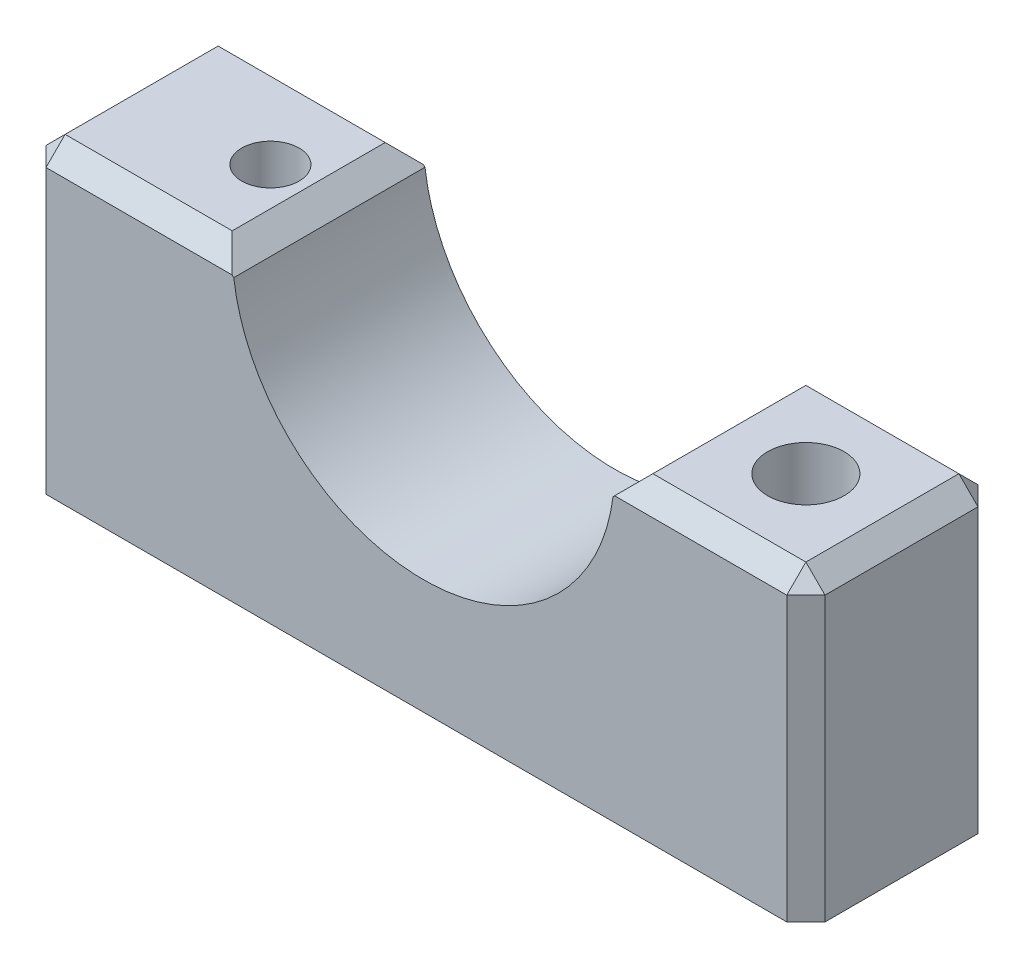
ISO-10303-21;
HEADER;
FILE_DESCRIPTION(('STEP AP214'),'2;1');
FILE_NAME('part.step','',(''),(''),'','','');
FILE_SCHEMA(('AUTOMOTIVE_DESIGN { 1 0 10303 214 1 1 1 1 }'));
ENDSEC;
DATA;
#1=APPLICATION_CONTEXT('core data for automotive mechanical design processes');
#2=APPLICATION_PROTOCOL_DEFINITION('international standard','automotive_design',2000,#1);
#3=PRODUCT_CONTEXT('',#1,'mechanical');
#4=PRODUCT('Part','Part','',(#3));
#5=PRODUCT_RELATED_PRODUCT_CATEGORY('part','',(#4));
#6=PRODUCT_DEFINITION_FORMATION('','',#4);
#7=PRODUCT_DEFINITION_CONTEXT('part definition',#1,'design');
#8=PRODUCT_DEFINITION('design','',#6,#7);
#9=PRODUCT_DEFINITION_SHAPE('','',#8);
#10=(LENGTH_UNIT() NAMED_UNIT(*) SI_UNIT(.MILLI.,.METRE.));
#11=(NAMED_UNIT(*) PLANE_ANGLE_UNIT() SI_UNIT($,.RADIAN.));
#12=(NAMED_UNIT(*) SI_UNIT($,.STERADIAN.) SOLID_ANGLE_UNIT());
#13=UNCERTAINTY_MEASURE_WITH_UNIT(LENGTH_MEASURE(1.E-05),#10,'distance_accuracy_value','');
#14=(GEOMETRIC_REPRESENTATION_CONTEXT(3) GLOBAL_UNCERTAINTY_ASSIGNED_CONTEXT((#13)) GLOBAL_UNIT_ASSIGNED_CONTEXT((#10,
#11,#12)) REPRESENTATION_CONTEXT('',''));
#15=CARTESIAN_POINT('',(0.,0.,0.));
#16=DIRECTION('',(0.,0.,1.));
#17=DIRECTION('',(1.,0.,0.));
#18=AXIS2_PLACEMENT_3D('',#15,#16,#17);
#19=CARTESIAN_POINT('',(0.,15.8,0.));
#20=DIRECTION('',(0.,1.,0.));
#21=DIRECTION('',(0.,0.,1.));
#22=AXIS2_PLACEMENT_3D('',#19,#20,#21);
#23=PLANE('',#22);
#24=DIRECTION('',(1.,0.,0.));
#25=VECTOR('',#24,1.);
#26=CARTESIAN_POINT('',(-9.99799979996,15.8,4.));
#27=LINE('',#26,#25);
#28=CARTESIAN_POINT('',(-19.7351198682707,15.8,4.));
#29=VERTEX_POINT('',#28);
#30=CARTESIAN_POINT('',(-10.99799979996,15.8,4.));
#31=VERTEX_POINT('',#30);
#32=EDGE_CURVE('E208',#29,#31,#27,.T.);
#33=ORIENTED_EDGE('',*,*,#32,.T.);
#34=DIRECTION('',(0.,0.,-1.));
#35=VECTOR('',#34,1.);
#36=CARTESIAN_POINT('',(-10.99799979996,15.8,-5.));
#37=LINE('',#36,#35);
#38=CARTESIAN_POINT('',(-10.99799979996,15.8,-4.));
#39=VERTEX_POINT('',#38);
#40=EDGE_CURVE('E212',#31,#39,#37,.T.);
#41=ORIENTED_EDGE('',*,*,#40,.T.);
#42=DIRECTION('',(-1.,0.,0.));
#43=VECTOR('',#42,1.);
#44=CARTESIAN_POINT('',(-20.7351198682707,15.8,-4.));
#45=LINE('',#44,#43);
#46=CARTESIAN_POINT('',(-19.7351198682707,15.8,-4.));
#47=VERTEX_POINT('',#46);
#48=EDGE_CURVE('E210',#39,#47,#45,.T.);
#49=ORIENTED_EDGE('',*,*,#48,.T.);
#50=DIRECTION('',(0.,0.,1.));
#51=VECTOR('',#50,1.);
#52=CARTESIAN_POINT('',(-19.7351198682707,15.8,5.));
#53=LINE('',#52,#51);
#54=EDGE_CURVE('E159',#47,#29,#53,.T.);
#55=ORIENTED_EDGE('',*,*,#54,.T.);
#56=EDGE_LOOP('',(#33,#41,#49,#55));
#57=FACE_BOUND('',#56,.T.);
#58=CARTESIAN_POINT('',(-13.,15.8,0.));
#59=DIRECTION('',(0.,1.,0.));
#60=DIRECTION('',(0.,0.,1.));
#61=AXIS2_PLACEMENT_3D('',#58,#59,#60);
#62=CIRCLE('',#61,1.5);
#63=CARTESIAN_POINT('',(-13.,15.8,1.5));
#64=VERTEX_POINT('',#63);
#65=EDGE_CURVE('E312',#64,#64,#62,.T.);
#66=ORIENTED_EDGE('',*,*,#65,.F.);
#67=EDGE_LOOP('',(#66));
#68=FACE_BOUND('',#67,.T.);
#69=ADVANCED_FACE('F37',(#57,#68),#23,.T.);
#70=DIRECTION('',(-1.,0.,0.));
#71=VECTOR('',#70,1.);
#72=CARTESIAN_POINT('',(9.99799979996,15.8,-3.99999999999999));
#73=LINE('',#72,#71);
#74=CARTESIAN_POINT('',(19.,15.8,-3.99999999999999));
#75=VERTEX_POINT('',#74);
#76=CARTESIAN_POINT('',(10.99799979996,15.8,-3.99999999999999));
#77=VERTEX_POINT('',#76);
#78=EDGE_CURVE('E191',#75,#77,#73,.T.);
#79=ORIENTED_EDGE('',*,*,#78,.T.);
#80=DIRECTION('',(0.,0.,1.));
#81=VECTOR('',#80,1.);
#82=CARTESIAN_POINT('',(10.99799979996,15.8,5.));
#83=LINE('',#82,#81);
#84=CARTESIAN_POINT('',(10.99799979996,15.8,3.99999999999999));
#85=VERTEX_POINT('',#84);
#86=EDGE_CURVE('E195',#77,#85,#83,.T.);
#87=ORIENTED_EDGE('',*,*,#86,.T.);
#88=DIRECTION('',(1.,0.,0.));
#89=VECTOR('',#88,1.);
#90=CARTESIAN_POINT('',(20.,15.8,3.99999999999999));
#91=LINE('',#90,#89);
#92=CARTESIAN_POINT('',(19.,15.8,3.99999999999999));
#93=VERTEX_POINT('',#92);
#94=EDGE_CURVE('E193',#85,#93,#91,.T.);
#95=ORIENTED_EDGE('',*,*,#94,.T.);
#96=DIRECTION('',(0.,0.,-1.));
#97=VECTOR('',#96,1.);
#98=CARTESIAN_POINT('',(19.,15.8,-5.));
#99=LINE('',#98,#97);
#100=EDGE_CURVE('E189',#93,#75,#99,.T.);
#101=ORIENTED_EDGE('',*,*,#100,.T.);
#102=EDGE_LOOP('',(#79,#87,#95,#101));
#103=FACE_BOUND('',#102,.T.);
#104=CARTESIAN_POINT('',(15.,15.8,0.));
#105=DIRECTION('',(0.,1.,0.));
#106=DIRECTION('',(0.,0.,1.));
#107=AXIS2_PLACEMENT_3D('',#104,#105,#106);
#108=CIRCLE('',#107,2.);
#109=CARTESIAN_POINT('',(15.,15.8,2.));
#110=VERTEX_POINT('',#109);
#111=EDGE_CURVE('E306',#110,#110,#108,.T.);
#112=ORIENTED_EDGE('',*,*,#111,.F.);
#113=EDGE_LOOP('',(#112));
#114=FACE_BOUND('',#113,.T.);
#115=ADVANCED_FACE('F367',(#103,#114),#23,.T.);
#116=CARTESIAN_POINT('',(0.,0.,0.));
#117=DIRECTION('',(0.,1.,0.));
#118=DIRECTION('',(0.,0.,1.));
#119=AXIS2_PLACEMENT_3D('',#116,#117,#118);
#120=PLANE('',#119);
#121=DIRECTION('',(-1.,0.,0.));
#122=VECTOR('',#121,1.);
#123=CARTESIAN_POINT('',(-18.,0.,-5.));
#124=LINE('',#123,#122);
#125=CARTESIAN_POINT('',(19.,0.,-5.));
#126=VERTEX_POINT('',#125);
#127=CARTESIAN_POINT('',(-19.7351198682707,0.,-5.));
#128=VERTEX_POINT('',#127);
#129=EDGE_CURVE('E291',#126,#128,#124,.T.);
#130=ORIENTED_EDGE('',*,*,#129,.F.);
#131=DIRECTION('',(-0.707106781186549,0.,-0.707106781186546));
#132=VECTOR('',#131,1.);
#133=CARTESIAN_POINT('',(19.,0.,-5.));
#134=LINE('',#133,#132);
#135=CARTESIAN_POINT('',(20.,0.,-3.99999999999999));
#136=VERTEX_POINT('',#135);
#137=EDGE_CURVE('E221',#126,#136,#134,.F.);
#138=ORIENTED_EDGE('',*,*,#137,.T.);
#139=DIRECTION('',(0.,0.,-1.));
#140=VECTOR('',#139,1.);
#141=CARTESIAN_POINT('',(20.,0.,-5.));
#142=LINE('',#141,#140);
#143=CARTESIAN_POINT('',(20.,0.,3.99999999999999));
#144=VERTEX_POINT('',#143);
#145=EDGE_CURVE('E315',#144,#136,#142,.T.);
#146=ORIENTED_EDGE('',*,*,#145,.F.);
#147=DIRECTION('',(0.707106781186549,0.,-0.707106781186546));
#148=VECTOR('',#147,1.);
#149=CARTESIAN_POINT('',(20.,0.,3.99999999999999));
#150=LINE('',#149,#148);
#151=CARTESIAN_POINT('',(19.,0.,5.));
#152=VERTEX_POINT('',#151);
#153=EDGE_CURVE('E219',#144,#152,#150,.F.);
#154=ORIENTED_EDGE('',*,*,#153,.T.);
#155=DIRECTION('',(1.,0.,0.));
#156=VECTOR('',#155,1.);
#157=CARTESIAN_POINT('',(-18.,0.,5.));
#158=LINE('',#157,#156);
#159=CARTESIAN_POINT('',(-19.7351198682707,0.,5.));
#160=VERTEX_POINT('',#159);
#161=EDGE_CURVE('E170',#160,#152,#158,.T.);
#162=ORIENTED_EDGE('',*,*,#161,.F.);
#163=DIRECTION('',(0.707106781186547,0.,0.707106781186548));
#164=VECTOR('',#163,1.);
#165=CARTESIAN_POINT('',(-19.7351198682707,0.,5.));
#166=LINE('',#165,#164);
#167=CARTESIAN_POINT('',(-20.7351198682707,0.,4.));
#168=VERTEX_POINT('',#167);
#169=EDGE_CURVE('E215',#160,#168,#166,.F.);
#170=ORIENTED_EDGE('',*,*,#169,.T.);
#171=DIRECTION('',(0.,0.,-1.));
#172=VECTOR('',#171,1.);
#173=CARTESIAN_POINT('',(-20.7351198682707,0.,-5.));
#174=LINE('',#173,#172);
#175=CARTESIAN_POINT('',(-20.7351198682707,0.,-4.));
#176=VERTEX_POINT('',#175);
#177=EDGE_CURVE('E253',#168,#176,#174,.T.);
#178=ORIENTED_EDGE('',*,*,#177,.T.);
#179=DIRECTION('',(-0.707106781186548,0.,0.707106781186547));
#180=VECTOR('',#179,1.);
#181=CARTESIAN_POINT('',(-19.7351198682707,0.,-5.));
#182=LINE('',#181,#180);
#183=EDGE_CURVE('E217',#176,#128,#182,.F.);
#184=ORIENTED_EDGE('',*,*,#183,.T.);
#185=EDGE_LOOP('',(#130,#138,#146,#154,#162,#170,#178,#184));
#186=FACE_BOUND('',#185,.T.);
#187=CARTESIAN_POINT('',(-13.,0.,0.));
#188=DIRECTION('',(0.,1.,0.));
#189=DIRECTION('',(0.,0.,1.));
#190=AXIS2_PLACEMENT_3D('',#187,#188,#189);
#191=CIRCLE('',#190,1.5);
#192=CARTESIAN_POINT('',(-13.,0.,1.5));
#193=VERTEX_POINT('',#192);
#194=EDGE_CURVE('E309',#193,#193,#191,.T.);
#195=ORIENTED_EDGE('',*,*,#194,.T.);
#196=EDGE_LOOP('',(#195));
#197=FACE_BOUND('',#196,.T.);
#198=CARTESIAN_POINT('',(15.,0.,0.));
#199=DIRECTION('',(0.,1.,0.));
#200=DIRECTION('',(0.,0.,1.));
#201=AXIS2_PLACEMENT_3D('',#198,#199,#200);
#202=CIRCLE('',#201,2.);
#203=CARTESIAN_POINT('',(15.,0.,2.));
#204=VERTEX_POINT('',#203);
#205=EDGE_CURVE('E303',#204,#204,#202,.T.);
#206=ORIENTED_EDGE('',*,*,#205,.T.);
#207=EDGE_LOOP('',(#206));
#208=FACE_BOUND('',#207,.T.);
#209=ADVANCED_FACE('F297',(#186,#197,#208),#120,.F.);
#210=CARTESIAN_POINT('',(20.,15.8,-5.));
#211=DIRECTION('',(-1.,0.,0.));
#212=DIRECTION('',(0.,0.,1.));
#213=AXIS2_PLACEMENT_3D('',#210,#211,#212);
#214=PLANE('',#213);
#215=ORIENTED_EDGE('',*,*,#145,.T.);
#216=DIRECTION('',(0.,1.,0.));
#217=VECTOR('',#216,1.);
#218=CARTESIAN_POINT('',(20.,15.8,-3.99999999999999));
#219=LINE('',#218,#217);
#220=CARTESIAN_POINT('',(20.,14.8,-3.99999999999999));
#221=VERTEX_POINT('',#220);
#222=EDGE_CURVE('E227',#136,#221,#219,.T.);
#223=ORIENTED_EDGE('',*,*,#222,.T.);
#224=DIRECTION('',(0.,0.,1.));
#225=VECTOR('',#224,1.);
#226=CARTESIAN_POINT('',(20.,14.8,5.));
#227=LINE('',#226,#225);
#228=CARTESIAN_POINT('',(20.,14.8,3.99999999999999));
#229=VERTEX_POINT('',#228);
#230=EDGE_CURVE('E223',#221,#229,#227,.T.);
#231=ORIENTED_EDGE('',*,*,#230,.T.);
#232=DIRECTION('',(0.,-1.,0.));
#233=VECTOR('',#232,1.);
#234=CARTESIAN_POINT('',(20.,15.8,3.99999999999999));
#235=LINE('',#234,#233);
#236=EDGE_CURVE('E225',#229,#144,#235,.T.);
#237=ORIENTED_EDGE('',*,*,#236,.T.);
#238=EDGE_LOOP('',(#215,#223,#231,#237));
#239=FACE_BOUND('',#238,.T.);
#240=ADVANCED_FACE('F358',(#239),#214,.F.);
#241=CARTESIAN_POINT('',(-18.,15.8,-5.));
#242=DIRECTION('',(0.,0.,1.));
#243=DIRECTION('',(1.,0.,0.));
#244=AXIS2_PLACEMENT_3D('',#241,#242,#243);
#245=PLANE('',#244);
#246=CARTESIAN_POINT('',(0.,16.,-5.));
#247=DIRECTION('',(0.,0.,1.));
#248=DIRECTION('',(1.,0.,0.));
#249=AXIS2_PLACEMENT_3D('',#246,#247,#248);
#250=CIRCLE('',#249,10.);
#251=CARTESIAN_POINT('',(-9.91770342303226,14.7197036230723,-5.));
#252=VERTEX_POINT('',#251);
#253=CARTESIAN_POINT('',(9.91770342303226,14.7197036230723,-5.));
#254=VERTEX_POINT('',#253);
#255=EDGE_CURVE('E301',#252,#254,#250,.T.);
#256=ORIENTED_EDGE('',*,*,#255,.T.);
#257=DIRECTION('',(0.707106781186546,0.707106781186549,0.));
#258=VECTOR('',#257,1.);
#259=CARTESIAN_POINT('',(9.91770342303226,14.7197036230723,-5.));
#260=LINE('',#259,#258);
#261=CARTESIAN_POINT('',(9.99799979996,14.8,-5.));
#262=VERTEX_POINT('',#261);
#263=EDGE_CURVE('E174',#254,#262,#260,.T.);
#264=ORIENTED_EDGE('',*,*,#263,.T.);
#265=DIRECTION('',(1.,0.,0.));
#266=VECTOR('',#265,1.);
#267=CARTESIAN_POINT('',(20.,14.8,-5.));
#268=LINE('',#267,#266);
#269=CARTESIAN_POINT('',(19.,14.8,-5.));
#270=VERTEX_POINT('',#269);
#271=EDGE_CURVE('E186',#262,#270,#268,.T.);
#272=ORIENTED_EDGE('',*,*,#271,.T.);
#273=DIRECTION('',(0.,-1.,0.));
#274=VECTOR('',#273,1.);
#275=CARTESIAN_POINT('',(19.,15.8,-5.));
#276=LINE('',#275,#274);
#277=EDGE_CURVE('E184',#270,#126,#276,.T.);
#278=ORIENTED_EDGE('',*,*,#277,.T.);
#279=ORIENTED_EDGE('',*,*,#129,.T.);
#280=DIRECTION('',(0.,1.,0.));
#281=VECTOR('',#280,1.);
#282=CARTESIAN_POINT('',(-19.7351198682707,15.8,-5.));
#283=LINE('',#282,#281);
#284=CARTESIAN_POINT('',(-19.7351198682707,14.8,-5.));
#285=VERTEX_POINT('',#284);
#286=EDGE_CURVE('E175',#128,#285,#283,.T.);
#287=ORIENTED_EDGE('',*,*,#286,.T.);
#288=DIRECTION('',(1.,0.,0.));
#289=VECTOR('',#288,1.);
#290=CARTESIAN_POINT('',(-9.99799979996,14.8,-5.));
#291=LINE('',#290,#289);
#292=CARTESIAN_POINT('',(-9.99799979996001,14.8,-5.));
#293=VERTEX_POINT('',#292);
#294=EDGE_CURVE('E177',#285,#293,#291,.T.);
#295=ORIENTED_EDGE('',*,*,#294,.T.);
#296=DIRECTION('',(-0.707106781186546,0.707106781186549,0.));
#297=VECTOR('',#296,1.);
#298=CARTESIAN_POINT('',(-9.91770342303226,14.7197036230723,-5.));
#299=LINE('',#298,#297);
#300=EDGE_CURVE('E182',#293,#252,#299,.F.);
#301=ORIENTED_EDGE('',*,*,#300,.T.);
#302=EDGE_LOOP('',(#256,#264,#272,#278,#279,#287,#295,#301));
#303=FACE_BOUND('',#302,.T.);
#304=ADVANCED_FACE('F287',(#303),#245,.F.);
#305=CARTESIAN_POINT('',(-18.,15.8,5.));
#306=DIRECTION('',(0.,0.,-1.));
#307=DIRECTION('',(-1.,0.,0.));
#308=AXIS2_PLACEMENT_3D('',#305,#306,#307);
#309=PLANE('',#308);
#310=DIRECTION('',(-1.,0.,0.));
#311=VECTOR('',#310,1.);
#312=CARTESIAN_POINT('',(9.99799979996,14.8,5.));
#313=LINE('',#312,#311);
#314=CARTESIAN_POINT('',(19.,14.8,5.));
#315=VERTEX_POINT('',#314);
#316=CARTESIAN_POINT('',(9.99799979996,14.8,5.));
#317=VERTEX_POINT('',#316);
#318=EDGE_CURVE('E155',#315,#317,#313,.T.);
#319=ORIENTED_EDGE('',*,*,#318,.T.);
#320=DIRECTION('',(-0.707106781186546,-0.707106781186549,0.));
#321=VECTOR('',#320,1.);
#322=CARTESIAN_POINT('',(9.91770342303226,14.7197036230723,5.));
#323=LINE('',#322,#321);
#324=CARTESIAN_POINT('',(9.91770342303226,14.7197036230723,5.));
#325=VERTEX_POINT('',#324);
#326=EDGE_CURVE('E150',#317,#325,#323,.T.);
#327=ORIENTED_EDGE('',*,*,#326,.T.);
#328=CARTESIAN_POINT('',(0.,16.,5.));
#329=DIRECTION('',(0.,0.,-1.));
#330=DIRECTION('',(-1.,0.,0.));
#331=AXIS2_PLACEMENT_3D('',#328,#329,#330);
#332=CIRCLE('',#331,10.);
#333=CARTESIAN_POINT('',(-9.91770342303226,14.7197036230723,5.));
#334=VERTEX_POINT('',#333);
#335=EDGE_CURVE('E153',#325,#334,#332,.T.);
#336=ORIENTED_EDGE('',*,*,#335,.T.);
#337=DIRECTION('',(0.707106781186546,-0.707106781186549,0.));
#338=VECTOR('',#337,1.);
#339=CARTESIAN_POINT('',(-9.91770342303226,14.7197036230723,5.));
#340=LINE('',#339,#338);
#341=CARTESIAN_POINT('',(-9.99799979996001,14.8,5.));
#342=VERTEX_POINT('',#341);
#343=EDGE_CURVE('E202',#334,#342,#340,.F.);
#344=ORIENTED_EDGE('',*,*,#343,.T.);
#345=DIRECTION('',(-1.,0.,0.));
#346=VECTOR('',#345,1.);
#347=CARTESIAN_POINT('',(-20.7351198682707,14.8,5.));
#348=LINE('',#347,#346);
#349=CARTESIAN_POINT('',(-19.7351198682707,14.8,5.));
#350=VERTEX_POINT('',#349);
#351=EDGE_CURVE('E200',#342,#350,#348,.T.);
#352=ORIENTED_EDGE('',*,*,#351,.T.);
#353=DIRECTION('',(0.,-1.,0.));
#354=VECTOR('',#353,1.);
#355=CARTESIAN_POINT('',(-19.7351198682707,15.8,5.));
#356=LINE('',#355,#354);
#357=EDGE_CURVE('E198',#350,#160,#356,.T.);
#358=ORIENTED_EDGE('',*,*,#357,.T.);
#359=ORIENTED_EDGE('',*,*,#161,.T.);
#360=DIRECTION('',(0.,1.,0.));
#361=VECTOR('',#360,1.);
#362=CARTESIAN_POINT('',(19.,15.8,5.));
#363=LINE('',#362,#361);
#364=EDGE_CURVE('E204',#152,#315,#363,.T.);
#365=ORIENTED_EDGE('',*,*,#364,.T.);
#366=EDGE_LOOP('',(#319,#327,#336,#344,#352,#358,#359,#365));
#367=FACE_BOUND('',#366,.T.);
#368=ADVANCED_FACE('F152',(#367),#309,.F.);
#369=CARTESIAN_POINT('',(-13.,15.8,0.));
#370=DIRECTION('',(0.,-1.,0.));
#371=DIRECTION('',(0.,0.,-1.));
#372=AXIS2_PLACEMENT_3D('',#369,#370,#371);
#373=CYLINDRICAL_SURFACE('',#372,1.5);
#374=ORIENTED_EDGE('',*,*,#65,.T.);
#375=EDGE_LOOP('',(#374));
#376=FACE_BOUND('',#375,.T.);
#377=ORIENTED_EDGE('',*,*,#194,.F.);
#378=EDGE_LOOP('',(#377));
#379=FACE_BOUND('',#378,.T.);
#380=ADVANCED_FACE('F378',(#376,#379),#373,.F.);
#381=CARTESIAN_POINT('',(15.,15.8,0.));
#382=DIRECTION('',(0.,-1.,0.));
#383=DIRECTION('',(0.,0.,-1.));
#384=AXIS2_PLACEMENT_3D('',#381,#382,#383);
#385=CYLINDRICAL_SURFACE('',#384,2.);
#386=ORIENTED_EDGE('',*,*,#111,.T.);
#387=EDGE_LOOP('',(#386));
#388=FACE_BOUND('',#387,.T.);
#389=ORIENTED_EDGE('',*,*,#205,.F.);
#390=EDGE_LOOP('',(#389));
#391=FACE_BOUND('',#390,.T.);
#392=ADVANCED_FACE('F385',(#388,#391),#385,.F.);
#393=CARTESIAN_POINT('',(0.,16.,-5.));
#394=DIRECTION('',(0.,0.,1.));
#395=DIRECTION('',(1.,0.,0.));
#396=AXIS2_PLACEMENT_3D('',#393,#394,#395);
#397=CYLINDRICAL_SURFACE('',#396,10.);
#398=ORIENTED_EDGE('',*,*,#335,.F.);
#399=DIRECTION('',(0.,0.,1.));
#400=VECTOR('',#399,1.);
#401=CARTESIAN_POINT('',(9.91770342303226,14.7197036230723,-5.));
#402=LINE('',#401,#400);
#403=EDGE_CURVE('E166',#325,#254,#402,.F.);
#404=ORIENTED_EDGE('',*,*,#403,.T.);
#405=ORIENTED_EDGE('',*,*,#255,.F.);
#406=DIRECTION('',(0.,0.,1.));
#407=VECTOR('',#406,1.);
#408=CARTESIAN_POINT('',(-9.91770342303226,14.7197036230723,-5.));
#409=LINE('',#408,#407);
#410=EDGE_CURVE('E169',#252,#334,#409,.T.);
#411=ORIENTED_EDGE('',*,*,#410,.T.);
#412=EDGE_LOOP('',(#398,#404,#405,#411));
#413=FACE_BOUND('',#412,.T.);
#414=ADVANCED_FACE('F164',(#413),#397,.F.);
#415=CARTESIAN_POINT('',(-20.7351198682707,1.98278893304149E-12,-17.735954124484));
#416=DIRECTION('',(1.,0.,0.));
#417=DIRECTION('',(0.,0.,-1.));
#418=AXIS2_PLACEMENT_3D('',#415,#416,#417);
#419=PLANE('',#418);
#420=DIRECTION('',(0.,0.,-1.));
#421=VECTOR('',#420,1.);
#422=CARTESIAN_POINT('',(-20.7351198682707,14.8,-5.));
#423=LINE('',#422,#421);
#424=CARTESIAN_POINT('',(-20.7351198682707,14.8,4.));
#425=VERTEX_POINT('',#424);
#426=CARTESIAN_POINT('',(-20.7351198682707,14.8,-4.));
#427=VERTEX_POINT('',#426);
#428=EDGE_CURVE('E54',#425,#427,#423,.T.);
#429=ORIENTED_EDGE('',*,*,#428,.T.);
#430=DIRECTION('',(0.,-1.,0.));
#431=VECTOR('',#430,1.);
#432=CARTESIAN_POINT('',(-20.7351198682707,1.98278893304149E-12,-4.));
#433=LINE('',#432,#431);
#434=EDGE_CURVE('E11',#427,#176,#433,.T.);
#435=ORIENTED_EDGE('',*,*,#434,.T.);
#436=ORIENTED_EDGE('',*,*,#177,.F.);
#437=DIRECTION('',(0.,1.,0.));
#438=VECTOR('',#437,1.);
#439=CARTESIAN_POINT('',(-20.7351198682707,1.98278893304149E-12,4.));
#440=LINE('',#439,#438);
#441=EDGE_CURVE('E47',#168,#425,#440,.T.);
#442=ORIENTED_EDGE('',*,*,#441,.T.);
#443=EDGE_LOOP('',(#429,#435,#436,#442));
#444=FACE_BOUND('',#443,.T.);
#445=ADVANCED_FACE('F295',(#444),#419,.F.);
#446=CARTESIAN_POINT('',(20.,15.8,3.99999999999999));
#447=DIRECTION('',(-0.707106781186546,0.,-0.707106781186549));
#448=DIRECTION('',(0.,-1.,0.));
#449=AXIS2_PLACEMENT_3D('',#446,#447,#448);
#450=PLANE('',#449);
#451=ORIENTED_EDGE('',*,*,#153,.F.);
#452=ORIENTED_EDGE('',*,*,#236,.F.);
#453=DIRECTION('',(-0.707106781186549,0.,0.707106781186546));
#454=VECTOR('',#453,1.);
#455=CARTESIAN_POINT('',(19.5,14.8,4.5));
#456=LINE('',#455,#454);
#457=EDGE_CURVE('E247',#315,#229,#456,.F.);
#458=ORIENTED_EDGE('',*,*,#457,.F.);
#459=ORIENTED_EDGE('',*,*,#364,.F.);
#460=EDGE_LOOP('',(#451,#452,#458,#459));
#461=FACE_BOUND('',#460,.T.);
#462=ADVANCED_FACE('F327',(#461),#450,.F.);
#463=CARTESIAN_POINT('',(19.,15.8,-5.));
#464=DIRECTION('',(-0.707106781186546,0.,0.707106781186549));
#465=DIRECTION('',(0.,-1.,0.));
#466=AXIS2_PLACEMENT_3D('',#463,#464,#465);
#467=PLANE('',#466);
#468=ORIENTED_EDGE('',*,*,#137,.F.);
#469=ORIENTED_EDGE('',*,*,#277,.F.);
#470=DIRECTION('',(0.707106781186549,0.,0.707106781186546));
#471=VECTOR('',#470,1.);
#472=CARTESIAN_POINT('',(19.,14.8,-5.));
#473=LINE('',#472,#471);
#474=EDGE_CURVE('E244',#221,#270,#473,.F.);
#475=ORIENTED_EDGE('',*,*,#474,.F.);
#476=ORIENTED_EDGE('',*,*,#222,.F.);
#477=EDGE_LOOP('',(#468,#469,#475,#476));
#478=FACE_BOUND('',#477,.T.);
#479=ADVANCED_FACE('F348',(#478),#467,.F.);
#480=CARTESIAN_POINT('',(19.,15.8,0.));
#481=DIRECTION('',(0.707106781186547,0.707106781186547,0.));
#482=DIRECTION('',(0.,0.,1.));
#483=AXIS2_PLACEMENT_3D('',#480,#481,#482);
#484=PLANE('',#483);
#485=DIRECTION('',(-0.707106781186548,0.707106781186548,0.));
#486=VECTOR('',#485,1.);
#487=CARTESIAN_POINT('',(19.,15.8,3.99999999999999));
#488=LINE('',#487,#486);
#489=EDGE_CURVE('E250',#229,#93,#488,.T.);
#490=ORIENTED_EDGE('',*,*,#489,.F.);
#491=ORIENTED_EDGE('',*,*,#230,.F.);
#492=DIRECTION('',(0.707106781186548,-0.707106781186548,0.));
#493=VECTOR('',#492,1.);
#494=CARTESIAN_POINT('',(19.5,15.3,-3.99999999999999));
#495=LINE('',#494,#493);
#496=EDGE_CURVE('E241',#75,#221,#495,.T.);
#497=ORIENTED_EDGE('',*,*,#496,.F.);
#498=ORIENTED_EDGE('',*,*,#100,.F.);
#499=EDGE_LOOP('',(#490,#491,#497,#498));
#500=FACE_BOUND('',#499,.T.);
#501=ADVANCED_FACE('F356',(#500),#484,.T.);
#502=CARTESIAN_POINT('',(19.,15.8,3.99999999999999));
#503=DIRECTION('',(0.577350269189625,0.577350269189625,0.577350269189627));
#504=DIRECTION('',(0.707106781186549,0.,-0.707106781186546));
#505=AXIS2_PLACEMENT_3D('',#502,#503,#504);
#506=PLANE('',#505);
#507=ORIENTED_EDGE('',*,*,#457,.T.);
#508=ORIENTED_EDGE('',*,*,#489,.T.);
#509=DIRECTION('',(0.,-0.707106781186547,0.707106781186547));
#510=VECTOR('',#509,1.);
#511=CARTESIAN_POINT('',(19.,15.8,3.99999999999999));
#512=LINE('',#511,#510);
#513=EDGE_CURVE('E238',#315,#93,#512,.F.);
#514=ORIENTED_EDGE('',*,*,#513,.F.);
#515=EDGE_LOOP('',(#507,#508,#514));
#516=FACE_BOUND('',#515,.T.);
#517=ADVANCED_FACE('F332',(#516),#506,.T.);
#518=CARTESIAN_POINT('',(19.,14.8,-5.));
#519=DIRECTION('',(0.577350269189625,0.577350269189625,-0.577350269189627));
#520=DIRECTION('',(0.,0.707106781186549,0.707106781186546));
#521=AXIS2_PLACEMENT_3D('',#518,#519,#520);
#522=PLANE('',#521);
#523=ORIENTED_EDGE('',*,*,#496,.T.);
#524=ORIENTED_EDGE('',*,*,#474,.T.);
#525=DIRECTION('',(0.,0.707106781186548,0.707106781186548));
#526=VECTOR('',#525,1.);
#527=CARTESIAN_POINT('',(19.,14.8,-5.));
#528=LINE('',#527,#526);
#529=EDGE_CURVE('E235',#75,#270,#528,.F.);
#530=ORIENTED_EDGE('',*,*,#529,.F.);
#531=EDGE_LOOP('',(#523,#524,#530));
#532=FACE_BOUND('',#531,.T.);
#533=ADVANCED_FACE('F351',(#532),#522,.T.);
#534=CARTESIAN_POINT('',(0.,15.8,3.99999999999999));
#535=DIRECTION('',(0.,0.707106781186547,0.707106781186547));
#536=DIRECTION('',(-1.,0.,0.));
#537=AXIS2_PLACEMENT_3D('',#534,#535,#536);
#538=PLANE('',#537);
#539=ORIENTED_EDGE('',*,*,#513,.T.);
#540=ORIENTED_EDGE('',*,*,#94,.F.);
#541=DIRECTION('',(-0.577350269189625,-0.577350269189626,0.577350269189626));
#542=VECTOR('',#541,1.);
#543=CARTESIAN_POINT('',(7.33199986664002,12.13400006668,7.66599993331999));
#544=LINE('',#543,#542);
#545=EDGE_CURVE('E233',#317,#85,#544,.F.);
#546=ORIENTED_EDGE('',*,*,#545,.F.);
#547=ORIENTED_EDGE('',*,*,#318,.F.);
#548=EDGE_LOOP('',(#539,#540,#546,#547));
#549=FACE_BOUND('',#548,.T.);
#550=ADVANCED_FACE('F335',(#549),#538,.T.);
#551=CARTESIAN_POINT('',(0.,15.8,-3.99999999999999));
#552=DIRECTION('',(0.,0.707106781186547,-0.707106781186547));
#553=DIRECTION('',(1.,0.,0.));
#554=AXIS2_PLACEMENT_3D('',#551,#552,#553);
#555=PLANE('',#554);
#556=ORIENTED_EDGE('',*,*,#529,.T.);
#557=ORIENTED_EDGE('',*,*,#271,.F.);
#558=DIRECTION('',(0.577350269189625,0.577350269189626,0.577350269189626));
#559=VECTOR('',#558,1.);
#560=CARTESIAN_POINT('',(7.33199986664002,12.13400006668,-7.66599993331999));
#561=LINE('',#560,#559);
#562=EDGE_CURVE('E231',#77,#262,#561,.F.);
#563=ORIENTED_EDGE('',*,*,#562,.F.);
#564=ORIENTED_EDGE('',*,*,#78,.F.);
#565=EDGE_LOOP('',(#556,#557,#563,#564));
#566=FACE_BOUND('',#565,.T.);
#567=ADVANCED_FACE('F342',(#566),#555,.T.);
#568=CARTESIAN_POINT('',(9.91770342303226,14.7197036230723,-5.));
#569=DIRECTION('',(-0.707106781186549,0.707106781186546,0.));
#570=DIRECTION('',(0.,0.,1.));
#571=AXIS2_PLACEMENT_3D('',#568,#569,#570);
#572=PLANE('',#571);
#573=ORIENTED_EDGE('',*,*,#545,.T.);
#574=ORIENTED_EDGE('',*,*,#86,.F.);
#575=ORIENTED_EDGE('',*,*,#562,.T.);
#576=ORIENTED_EDGE('',*,*,#263,.F.);
#577=ORIENTED_EDGE('',*,*,#403,.F.);
#578=ORIENTED_EDGE('',*,*,#326,.F.);
#579=EDGE_LOOP('',(#573,#574,#575,#576,#577,#578));
#580=FACE_BOUND('',#579,.T.);
#581=ADVANCED_FACE('F172',(#580),#572,.T.);
#582=CARTESIAN_POINT('',(-19.7351198682707,15.8,-5.));
#583=DIRECTION('',(0.707106781186547,0.,0.707106781186548));
#584=DIRECTION('',(0.,1.,0.));
#585=AXIS2_PLACEMENT_3D('',#582,#583,#584);
#586=PLANE('',#585);
#587=ORIENTED_EDGE('',*,*,#183,.F.);
#588=ORIENTED_EDGE('',*,*,#434,.F.);
#589=DIRECTION('',(0.707106781186548,0.,-0.707106781186547));
#590=VECTOR('',#589,1.);
#591=CARTESIAN_POINT('',(-20.2351198682707,14.8,-4.5));
#592=LINE('',#591,#590);
#593=EDGE_CURVE('E270',#285,#427,#592,.F.);
#594=ORIENTED_EDGE('',*,*,#593,.F.);
#595=ORIENTED_EDGE('',*,*,#286,.F.);
#596=EDGE_LOOP('',(#587,#588,#594,#595));
#597=FACE_BOUND('',#596,.T.);
#598=ADVANCED_FACE('F40',(#597),#586,.F.);
#599=CARTESIAN_POINT('',(-19.7351198682707,15.8,5.));
#600=DIRECTION('',(0.707106781186548,0.,-0.707106781186547));
#601=DIRECTION('',(0.,-1.,0.));
#602=AXIS2_PLACEMENT_3D('',#599,#600,#601);
#603=PLANE('',#602);
#604=ORIENTED_EDGE('',*,*,#169,.F.);
#605=ORIENTED_EDGE('',*,*,#357,.F.);
#606=DIRECTION('',(-0.707106781186547,0.,-0.707106781186548));
#607=VECTOR('',#606,1.);
#608=CARTESIAN_POINT('',(-19.7351198682707,14.8,5.));
#609=LINE('',#608,#607);
#610=EDGE_CURVE('E268',#425,#350,#609,.F.);
#611=ORIENTED_EDGE('',*,*,#610,.F.);
#612=ORIENTED_EDGE('',*,*,#441,.F.);
#613=EDGE_LOOP('',(#604,#605,#611,#612));
#614=FACE_BOUND('',#613,.T.);
#615=ADVANCED_FACE('F454',(#614),#603,.F.);
#616=CARTESIAN_POINT('',(-19.7351198682707,15.8,0.));
#617=DIRECTION('',(-0.707106781186549,0.707106781186546,0.));
#618=DIRECTION('',(0.,0.,-1.));
#619=AXIS2_PLACEMENT_3D('',#616,#617,#618);
#620=PLANE('',#619);
#621=DIRECTION('',(0.707106781186546,0.707106781186549,0.));
#622=VECTOR('',#621,1.);
#623=CARTESIAN_POINT('',(-19.7351198682707,15.8,-4.));
#624=LINE('',#623,#622);
#625=EDGE_CURVE('E42',#427,#47,#624,.T.);
#626=ORIENTED_EDGE('',*,*,#625,.F.);
#627=ORIENTED_EDGE('',*,*,#428,.F.);
#628=DIRECTION('',(-0.707106781186546,-0.707106781186549,0.));
#629=VECTOR('',#628,1.);
#630=CARTESIAN_POINT('',(-20.2351198682707,15.3,4.));
#631=LINE('',#630,#629);
#632=EDGE_CURVE('E265',#29,#425,#631,.T.);
#633=ORIENTED_EDGE('',*,*,#632,.F.);
#634=ORIENTED_EDGE('',*,*,#54,.F.);
#635=EDGE_LOOP('',(#626,#627,#633,#634));
#636=FACE_BOUND('',#635,.T.);
#637=ADVANCED_FACE('F449',(#636),#620,.T.);
#638=CARTESIAN_POINT('',(-19.7351198682707,15.8,-4.));
#639=DIRECTION('',(-0.577350269189627,0.577350269189625,-0.577350269189626));
#640=DIRECTION('',(-0.707106781186547,0.,0.707106781186548));
#641=AXIS2_PLACEMENT_3D('',#638,#639,#640);
#642=PLANE('',#641);
#643=ORIENTED_EDGE('',*,*,#593,.T.);
#644=ORIENTED_EDGE('',*,*,#625,.T.);
#645=DIRECTION('',(0.,-0.707106781186547,-0.707106781186547));
#646=VECTOR('',#645,1.);
#647=CARTESIAN_POINT('',(-19.7351198682707,15.8,-4.));
#648=LINE('',#647,#646);
#649=EDGE_CURVE('E262',#285,#47,#648,.F.);
#650=ORIENTED_EDGE('',*,*,#649,.F.);
#651=EDGE_LOOP('',(#643,#644,#650));
#652=FACE_BOUND('',#651,.T.);
#653=ADVANCED_FACE('F277',(#652),#642,.T.);
#654=CARTESIAN_POINT('',(-19.7351198682707,14.8,5.));
#655=DIRECTION('',(-0.577350269189627,0.577350269189624,0.577350269189626));
#656=DIRECTION('',(0.707106781186547,0.,0.707106781186548));
#657=AXIS2_PLACEMENT_3D('',#654,#655,#656);
#658=PLANE('',#657);
#659=ORIENTED_EDGE('',*,*,#632,.T.);
#660=ORIENTED_EDGE('',*,*,#610,.T.);
#661=DIRECTION('',(0.,0.707106781186547,-0.707106781186547));
#662=VECTOR('',#661,1.);
#663=CARTESIAN_POINT('',(-19.7351198682707,14.8,5.));
#664=LINE('',#663,#662);
#665=EDGE_CURVE('E259',#29,#350,#664,.F.);
#666=ORIENTED_EDGE('',*,*,#665,.F.);
#667=EDGE_LOOP('',(#659,#660,#666));
#668=FACE_BOUND('',#667,.T.);
#669=ADVANCED_FACE('F437',(#668),#658,.T.);
#670=CARTESIAN_POINT('',(0.,15.8,-4.));
#671=DIRECTION('',(0.,0.707106781186547,-0.707106781186547));
#672=DIRECTION('',(1.,0.,0.));
#673=AXIS2_PLACEMENT_3D('',#670,#671,#672);
#674=PLANE('',#673);
#675=ORIENTED_EDGE('',*,*,#649,.T.);
#676=ORIENTED_EDGE('',*,*,#48,.F.);
#677=DIRECTION('',(-0.577350269189625,0.577350269189626,0.577350269189626));
#678=VECTOR('',#677,1.);
#679=CARTESIAN_POINT('',(-7.33199986664002,12.13400006668,-7.66599993332));
#680=LINE('',#679,#678);
#681=EDGE_CURVE('E257',#293,#39,#680,.T.);
#682=ORIENTED_EDGE('',*,*,#681,.F.);
#683=ORIENTED_EDGE('',*,*,#294,.F.);
#684=EDGE_LOOP('',(#675,#676,#682,#683));
#685=FACE_BOUND('',#684,.T.);
#686=ADVANCED_FACE('F283',(#685),#674,.T.);
#687=CARTESIAN_POINT('',(0.,15.8,4.));
#688=DIRECTION('',(0.,0.707106781186547,0.707106781186547));
#689=DIRECTION('',(-1.,0.,0.));
#690=AXIS2_PLACEMENT_3D('',#687,#688,#689);
#691=PLANE('',#690);
#692=ORIENTED_EDGE('',*,*,#665,.T.);
#693=ORIENTED_EDGE('',*,*,#351,.F.);
#694=DIRECTION('',(0.577350269189625,-0.577350269189626,0.577350269189626));
#695=VECTOR('',#694,1.);
#696=CARTESIAN_POINT('',(-7.33199986664002,12.13400006668,7.66599993332));
#697=LINE('',#696,#695);
#698=EDGE_CURVE('E254',#31,#342,#697,.T.);
#699=ORIENTED_EDGE('',*,*,#698,.F.);
#700=ORIENTED_EDGE('',*,*,#32,.F.);
#701=EDGE_LOOP('',(#692,#693,#699,#700));
#702=FACE_BOUND('',#701,.T.);
#703=ADVANCED_FACE('F424',(#702),#691,.T.);
#704=CARTESIAN_POINT('',(-9.91770342303226,14.7197036230723,-5.));
#705=DIRECTION('',(-0.707106781186549,-0.707106781186546,0.));
#706=DIRECTION('',(0.,0.,1.));
#707=AXIS2_PLACEMENT_3D('',#704,#705,#706);
#708=PLANE('',#707);
#709=ORIENTED_EDGE('',*,*,#681,.T.);
#710=ORIENTED_EDGE('',*,*,#40,.F.);
#711=ORIENTED_EDGE('',*,*,#698,.T.);
#712=ORIENTED_EDGE('',*,*,#343,.F.);
#713=ORIENTED_EDGE('',*,*,#410,.F.);
#714=ORIENTED_EDGE('',*,*,#300,.F.);
#715=EDGE_LOOP('',(#709,#710,#711,#712,#713,#714));
#716=FACE_BOUND('',#715,.T.);
#717=ADVANCED_FACE('F418',(#716),#708,.F.);
#718=CLOSED_SHELL('',(#69,#115,#209,#240,#304,#368,#380,#392,#414,#445,#462,#479,#501,#517,#533,
#550,#567,#581,#598,#615,#637,#653,#669,#686,#703,#717));
#719=MANIFOLD_SOLID_BREP('B2',#718);
#720=ADVANCED_BREP_SHAPE_REPRESENTATION('',(#18,#719),#14);
#721=SHAPE_DEFINITION_REPRESENTATION(#9,#720);
ENDSEC;
END-ISO-10303-21;
